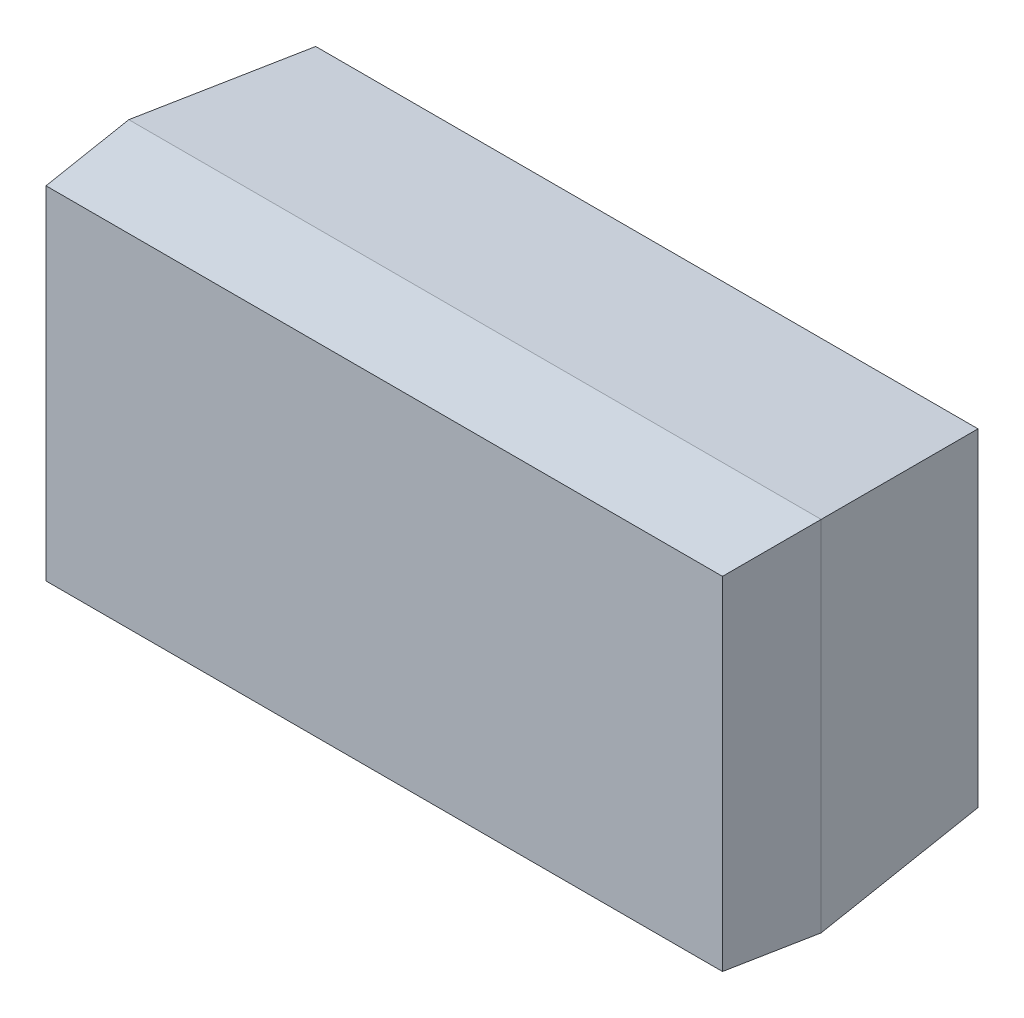
ISO-10303-21;
HEADER;
FILE_DESCRIPTION(('STEP AP214'),'2;1');
FILE_NAME('part.step','',(''),(''),'','','');
FILE_SCHEMA(('AUTOMOTIVE_DESIGN { 1 0 10303 214 1 1 1 1 }'));
ENDSEC;
DATA;
#1=APPLICATION_CONTEXT('core data for automotive mechanical design processes');
#2=APPLICATION_PROTOCOL_DEFINITION('international standard','automotive_design',2000,#1);
#3=PRODUCT_CONTEXT('',#1,'mechanical');
#4=PRODUCT('Part','Part','',(#3));
#5=PRODUCT_RELATED_PRODUCT_CATEGORY('part','',(#4));
#6=PRODUCT_DEFINITION_FORMATION('','',#4);
#7=PRODUCT_DEFINITION_CONTEXT('part definition',#1,'design');
#8=PRODUCT_DEFINITION('design','',#6,#7);
#9=PRODUCT_DEFINITION_SHAPE('','',#8);
#10=(LENGTH_UNIT() NAMED_UNIT(*) SI_UNIT(.MILLI.,.METRE.));
#11=(NAMED_UNIT(*) PLANE_ANGLE_UNIT() SI_UNIT($,.RADIAN.));
#12=(NAMED_UNIT(*) SI_UNIT($,.STERADIAN.) SOLID_ANGLE_UNIT());
#13=UNCERTAINTY_MEASURE_WITH_UNIT(LENGTH_MEASURE(1.E-05),#10,'distance_accuracy_value','');
#14=(GEOMETRIC_REPRESENTATION_CONTEXT(3) GLOBAL_UNCERTAINTY_ASSIGNED_CONTEXT((#13)) GLOBAL_UNIT_ASSIGNED_CONTEXT((#10,
#11,#12)) REPRESENTATION_CONTEXT('',''));
#15=CARTESIAN_POINT('',(0.,0.,0.));
#16=DIRECTION('',(0.,0.,1.));
#17=DIRECTION('',(1.,0.,0.));
#18=AXIS2_PLACEMENT_3D('',#15,#16,#17);
#19=CARTESIAN_POINT('',(0.,0.,0.05));
#20=DIRECTION('',(0.,0.,1.));
#21=DIRECTION('',(1.,0.,0.));
#22=AXIS2_PLACEMENT_3D('',#19,#20,#21);
#23=PLANE('',#22);
#24=DIRECTION('',(0.,1.,0.));
#25=VECTOR('',#24,1.);
#26=CARTESIAN_POINT('',(1.38700816226135,0.75,0.049999999999969));
#27=LINE('',#26,#25);
#28=CARTESIAN_POINT('',(1.38700816226109,0.687008162261089,0.0499999999999845));
#29=VERTEX_POINT('',#28);
#30=CARTESIAN_POINT('',(1.38700816226109,-0.687008162261089,0.0499999999999845));
#31=VERTEX_POINT('',#30);
#32=EDGE_CURVE('E71',#29,#31,#27,.F.);
#33=ORIENTED_EDGE('',*,*,#32,.T.);
#34=DIRECTION('',(1.,0.,0.));
#35=VECTOR('',#34,1.);
#36=CARTESIAN_POINT('',(-1.45,-0.687008162261354,0.049999999999969));
#37=LINE('',#36,#35);
#38=CARTESIAN_POINT('',(-1.38700816226109,-0.687008162261089,0.0499999999999845));
#39=VERTEX_POINT('',#38);
#40=EDGE_CURVE('E73',#31,#39,#37,.F.);
#41=ORIENTED_EDGE('',*,*,#40,.T.);
#42=DIRECTION('',(0.,1.,0.));
#43=VECTOR('',#42,1.);
#44=CARTESIAN_POINT('',(-1.387008162261,0.,0.05));
#45=LINE('',#44,#43);
#46=CARTESIAN_POINT('',(-1.38700816226109,0.687008162261089,0.0499999999999845));
#47=VERTEX_POINT('',#46);
#48=EDGE_CURVE('E20',#47,#39,#45,.F.);
#49=ORIENTED_EDGE('',*,*,#48,.F.);
#50=DIRECTION('',(1.,0.,0.));
#51=VECTOR('',#50,1.);
#52=CARTESIAN_POINT('',(-1.45,0.687008162261354,0.049999999999969));
#53=LINE('',#52,#51);
#54=EDGE_CURVE('E68',#47,#29,#53,.T.);
#55=ORIENTED_EDGE('',*,*,#54,.T.);
#56=EDGE_LOOP('',(#33,#41,#49,#55));
#57=FACE_BOUND('',#56,.T.);
#58=ADVANCED_FACE('F17',(#57),#23,.F.);
#59=CARTESIAN_POINT('',(-1.45,-0.75,0.77));
#60=DIRECTION('',(0.,0.996194698091748,0.087155742747628));
#61=DIRECTION('',(0.,-0.087155742747628,0.996194698091748));
#62=AXIS2_PLACEMENT_3D('',#59,#60,#61);
#63=PLANE('',#62);
#64=ORIENTED_EDGE('',*,*,#40,.F.);
#65=DIRECTION('',(0.0868265938642139,-0.086826593864702,0.99243250913893));
#66=VECTOR('',#65,1.);
#67=CARTESIAN_POINT('',(1.38700816226135,-0.687008162261,0.049999999999969));
#68=LINE('',#67,#66);
#69=CARTESIAN_POINT('',(1.44999999999998,-0.749999999999961,0.769999999999995));
#70=VERTEX_POINT('',#69);
#71=EDGE_CURVE('E78',#31,#70,#68,.T.);
#72=ORIENTED_EDGE('',*,*,#71,.T.);
#73=DIRECTION('',(1.,0.,0.));
#74=VECTOR('',#73,1.);
#75=CARTESIAN_POINT('',(0.,-0.749999999999845,0.769999999999986));
#76=LINE('',#75,#74);
#77=CARTESIAN_POINT('',(-1.44999999999998,-0.749999999999981,0.769999999999997));
#78=VERTEX_POINT('',#77);
#79=EDGE_CURVE('E98',#78,#70,#76,.T.);
#80=ORIENTED_EDGE('',*,*,#79,.F.);
#81=DIRECTION('',(0.0868265938642139,0.086826593864702,-0.99243250913893));
#82=VECTOR('',#81,1.);
#83=CARTESIAN_POINT('',(-1.45,-0.75,0.77));
#84=LINE('',#83,#82);
#85=EDGE_CURVE('E84',#78,#39,#84,.T.);
#86=ORIENTED_EDGE('',*,*,#85,.T.);
#87=EDGE_LOOP('',(#64,#72,#80,#86));
#88=FACE_BOUND('',#87,.T.);
#89=ADVANCED_FACE('F81',(#88),#63,.F.);
#90=CARTESIAN_POINT('',(1.45,0.75,0.77));
#91=DIRECTION('',(-0.996194698091748,0.,0.087155742747628));
#92=DIRECTION('',(0.087155742747628,0.,0.996194698091748));
#93=AXIS2_PLACEMENT_3D('',#90,#91,#92);
#94=PLANE('',#93);
#95=ORIENTED_EDGE('',*,*,#32,.F.);
#96=DIRECTION('',(0.0868265938647017,0.0868265938642141,0.99243250913893));
#97=VECTOR('',#96,1.);
#98=CARTESIAN_POINT('',(1.387008162261,0.687008162261354,0.049999999999969));
#99=LINE('',#98,#97);
#100=CARTESIAN_POINT('',(1.44999999999996,0.749999999999981,0.769999999999995));
#101=VERTEX_POINT('',#100);
#102=EDGE_CURVE('E91',#29,#101,#99,.T.);
#103=ORIENTED_EDGE('',*,*,#102,.T.);
#104=DIRECTION('',(0.,1.,0.));
#105=VECTOR('',#104,1.);
#106=CARTESIAN_POINT('',(1.44999999999984,0.,0.769999999999986));
#107=LINE('',#106,#105);
#108=EDGE_CURVE('E88',#70,#101,#107,.T.);
#109=ORIENTED_EDGE('',*,*,#108,.F.);
#110=ORIENTED_EDGE('',*,*,#71,.F.);
#111=EDGE_LOOP('',(#95,#103,#109,#110));
#112=FACE_BOUND('',#111,.T.);
#113=ADVANCED_FACE('F86',(#112),#94,.F.);
#114=CARTESIAN_POINT('',(-1.45,0.75,0.77));
#115=DIRECTION('',(0.,-0.996194698091748,0.087155742747628));
#116=DIRECTION('',(0.,-0.087155742747628,-0.996194698091748));
#117=AXIS2_PLACEMENT_3D('',#114,#115,#116);
#118=PLANE('',#117);
#119=DIRECTION('',(1.,0.,0.));
#120=VECTOR('',#119,1.);
#121=CARTESIAN_POINT('',(0.,0.749999999999845,0.769999999999986));
#122=LINE('',#121,#120);
#123=CARTESIAN_POINT('',(-1.44999999999998,0.749999999999961,0.769999999999995));
#124=VERTEX_POINT('',#123);
#125=EDGE_CURVE('E106',#101,#124,#122,.F.);
#126=ORIENTED_EDGE('',*,*,#125,.F.);
#127=ORIENTED_EDGE('',*,*,#102,.F.);
#128=ORIENTED_EDGE('',*,*,#54,.F.);
#129=DIRECTION('',(-0.0868265938642139,0.086826593864702,0.99243250913893));
#130=VECTOR('',#129,1.);
#131=CARTESIAN_POINT('',(-1.38700816226135,0.687008162261,0.049999999999969));
#132=LINE('',#131,#130);
#133=EDGE_CURVE('E96',#47,#124,#132,.T.);
#134=ORIENTED_EDGE('',*,*,#133,.T.);
#135=EDGE_LOOP('',(#126,#127,#128,#134));
#136=FACE_BOUND('',#135,.T.);
#137=ADVANCED_FACE('F131',(#136),#118,.F.);
#138=CARTESIAN_POINT('',(-1.45,0.75,0.77));
#139=DIRECTION('',(0.996194698091748,0.,0.087155742747628));
#140=DIRECTION('',(0.087155742747628,0.,-0.996194698091748));
#141=AXIS2_PLACEMENT_3D('',#138,#139,#140);
#142=PLANE('',#141);
#143=ORIENTED_EDGE('',*,*,#48,.T.);
#144=ORIENTED_EDGE('',*,*,#85,.F.);
#145=DIRECTION('',(0.,1.,0.));
#146=VECTOR('',#145,1.);
#147=CARTESIAN_POINT('',(-1.44999999999984,0.,0.769999999999986));
#148=LINE('',#147,#146);
#149=EDGE_CURVE('E109',#124,#78,#148,.F.);
#150=ORIENTED_EDGE('',*,*,#149,.F.);
#151=ORIENTED_EDGE('',*,*,#133,.F.);
#152=EDGE_LOOP('',(#143,#144,#150,#151));
#153=FACE_BOUND('',#152,.T.);
#154=ADVANCED_FACE('F134',(#153),#142,.F.);
#155=CARTESIAN_POINT('',(0.,-0.71675430786,1.15));
#156=DIRECTION('',(0.,-0.996194698091747,0.0871557427476379));
#157=DIRECTION('',(0.,-0.0871557427476379,-0.996194698091747));
#158=AXIS2_PLACEMENT_3D('',#155,#156,#157);
#159=PLANE('',#158);
#160=DIRECTION('',(0.0868265938642244,-0.0868265938646304,-0.992432509138936));
#161=VECTOR('',#160,1.);
#162=CARTESIAN_POINT('',(1.41675430786,-0.71675430786,1.15));
#163=LINE('',#162,#161);
#164=CARTESIAN_POINT('',(1.41675430786,-0.71675430786,1.15));
#165=VERTEX_POINT('',#164);
#166=EDGE_CURVE('E100',#165,#70,#163,.T.);
#167=ORIENTED_EDGE('',*,*,#166,.F.);
#168=DIRECTION('',(1.,0.,0.));
#169=VECTOR('',#168,1.);
#170=CARTESIAN_POINT('',(0.,-0.71675430786,1.15));
#171=LINE('',#170,#169);
#172=CARTESIAN_POINT('',(-1.41675430786,-0.71675430786,1.15));
#173=VERTEX_POINT('',#172);
#174=EDGE_CURVE('E115',#173,#165,#171,.T.);
#175=ORIENTED_EDGE('',*,*,#174,.F.);
#176=DIRECTION('',(0.0868265938642243,0.0868265938646304,0.992432509138936));
#177=VECTOR('',#176,1.);
#178=CARTESIAN_POINT('',(-1.44999999999984,-0.75,0.769999999999986));
#179=LINE('',#178,#177);
#180=EDGE_CURVE('E112',#78,#173,#179,.T.);
#181=ORIENTED_EDGE('',*,*,#180,.F.);
#182=ORIENTED_EDGE('',*,*,#79,.T.);
#183=EDGE_LOOP('',(#167,#175,#181,#182));
#184=FACE_BOUND('',#183,.T.);
#185=ADVANCED_FACE('F139',(#184),#159,.T.);
#186=CARTESIAN_POINT('',(1.41675430786,0.,1.15));
#187=DIRECTION('',(0.996194698091747,0.,0.0871557427476379));
#188=DIRECTION('',(0.0871557427476379,0.,-0.996194698091747));
#189=AXIS2_PLACEMENT_3D('',#186,#187,#188);
#190=PLANE('',#189);
#191=DIRECTION('',(0.0868265938646304,0.0868265938642244,-0.992432509138936));
#192=VECTOR('',#191,1.);
#193=CARTESIAN_POINT('',(1.41675430786,0.71675430786,1.15));
#194=LINE('',#193,#192);
#195=CARTESIAN_POINT('',(1.41675430786,0.71675430786,1.15));
#196=VERTEX_POINT('',#195);
#197=EDGE_CURVE('E103',#196,#101,#194,.T.);
#198=ORIENTED_EDGE('',*,*,#197,.F.);
#199=DIRECTION('',(0.,1.,0.));
#200=VECTOR('',#199,1.);
#201=CARTESIAN_POINT('',(1.41675430786,0.,1.15));
#202=LINE('',#201,#200);
#203=EDGE_CURVE('E118',#165,#196,#202,.T.);
#204=ORIENTED_EDGE('',*,*,#203,.F.);
#205=ORIENTED_EDGE('',*,*,#166,.T.);
#206=ORIENTED_EDGE('',*,*,#108,.T.);
#207=EDGE_LOOP('',(#198,#204,#205,#206));
#208=FACE_BOUND('',#207,.T.);
#209=ADVANCED_FACE('F129',(#208),#190,.T.);
#210=CARTESIAN_POINT('',(0.,0.71675430786,1.15));
#211=DIRECTION('',(0.,0.996194698091747,0.0871557427476379));
#212=DIRECTION('',(0.,-0.0871557427476379,0.996194698091747));
#213=AXIS2_PLACEMENT_3D('',#210,#211,#212);
#214=PLANE('',#213);
#215=ORIENTED_EDGE('',*,*,#197,.T.);
#216=ORIENTED_EDGE('',*,*,#125,.T.);
#217=DIRECTION('',(-0.0868265938642244,0.0868265938646304,-0.992432509138936));
#218=VECTOR('',#217,1.);
#219=CARTESIAN_POINT('',(-1.41675430786,0.71675430786,1.15));
#220=LINE('',#219,#218);
#221=CARTESIAN_POINT('',(-1.41675430786,0.71675430786,1.15));
#222=VERTEX_POINT('',#221);
#223=EDGE_CURVE('E35',#222,#124,#220,.T.);
#224=ORIENTED_EDGE('',*,*,#223,.F.);
#225=DIRECTION('',(1.,0.,0.));
#226=VECTOR('',#225,1.);
#227=CARTESIAN_POINT('',(0.,0.71675430786,1.15));
#228=LINE('',#227,#226);
#229=EDGE_CURVE('E26',#196,#222,#228,.F.);
#230=ORIENTED_EDGE('',*,*,#229,.F.);
#231=EDGE_LOOP('',(#215,#216,#224,#230));
#232=FACE_BOUND('',#231,.T.);
#233=ADVANCED_FACE('F125',(#232),#214,.T.);
#234=CARTESIAN_POINT('',(-1.41675430786,0.,1.15));
#235=DIRECTION('',(-0.996194698091747,0.,0.0871557427476379));
#236=DIRECTION('',(0.0871557427476379,0.,0.996194698091747));
#237=AXIS2_PLACEMENT_3D('',#234,#235,#236);
#238=PLANE('',#237);
#239=ORIENTED_EDGE('',*,*,#180,.T.);
#240=DIRECTION('',(0.,1.,0.));
#241=VECTOR('',#240,1.);
#242=CARTESIAN_POINT('',(-1.41675430786,0.,1.15));
#243=LINE('',#242,#241);
#244=EDGE_CURVE('E11',#222,#173,#243,.F.);
#245=ORIENTED_EDGE('',*,*,#244,.F.);
#246=ORIENTED_EDGE('',*,*,#223,.T.);
#247=ORIENTED_EDGE('',*,*,#149,.T.);
#248=EDGE_LOOP('',(#239,#245,#246,#247));
#249=FACE_BOUND('',#248,.T.);
#250=ADVANCED_FACE('F137',(#249),#238,.T.);
#251=CARTESIAN_POINT('',(0.,0.,1.15));
#252=DIRECTION('',(0.,0.,1.));
#253=DIRECTION('',(1.,0.,0.));
#254=AXIS2_PLACEMENT_3D('',#251,#252,#253);
#255=PLANE('',#254);
#256=ORIENTED_EDGE('',*,*,#229,.T.);
#257=ORIENTED_EDGE('',*,*,#244,.T.);
#258=ORIENTED_EDGE('',*,*,#174,.T.);
#259=ORIENTED_EDGE('',*,*,#203,.T.);
#260=EDGE_LOOP('',(#256,#257,#258,#259));
#261=FACE_BOUND('',#260,.T.);
#262=ADVANCED_FACE('F123',(#261),#255,.T.);
#263=CLOSED_SHELL('',(#58,#89,#113,#137,#154,#185,#209,#233,#250,#262));
#264=MANIFOLD_SOLID_BREP('B1',#263);
#265=ADVANCED_BREP_SHAPE_REPRESENTATION('',(#18,#264),#14);
#266=SHAPE_DEFINITION_REPRESENTATION(#9,#265);
ENDSEC;
END-ISO-10303-21;
